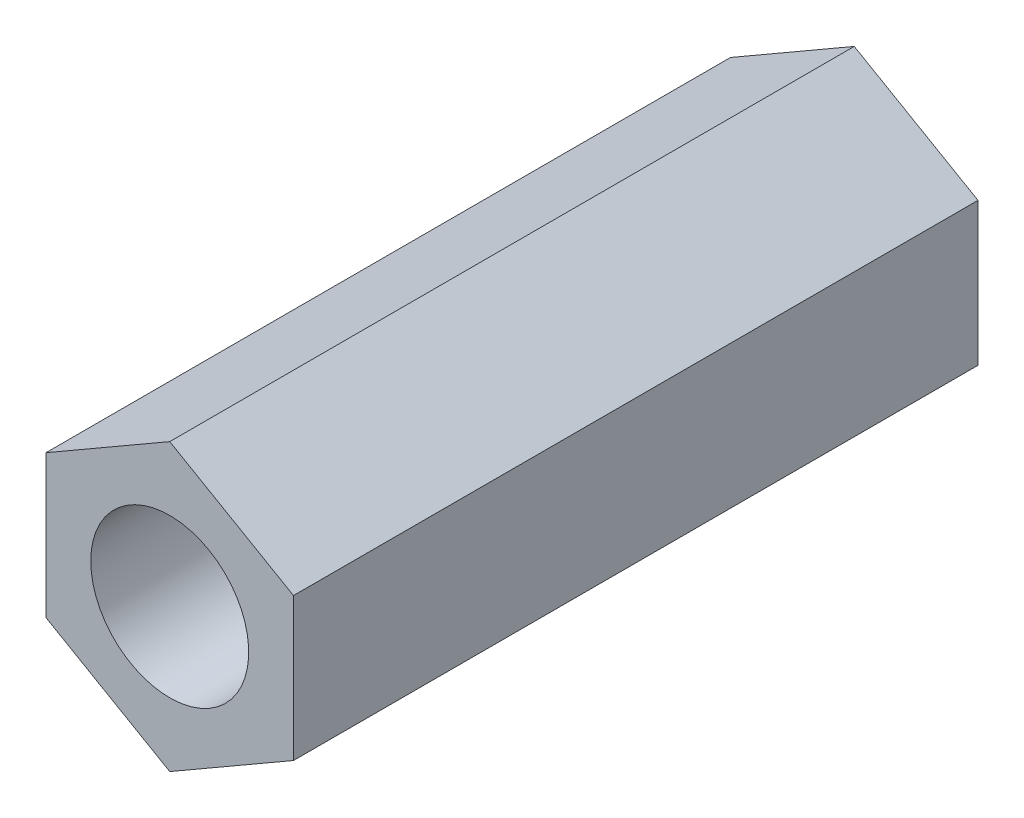
ISO-10303-21;
HEADER;
FILE_DESCRIPTION(('STEP AP214'),'2;1');
FILE_NAME('part.step','',(''),(''),'','','');
FILE_SCHEMA(('AUTOMOTIVE_DESIGN { 1 0 10303 214 1 1 1 1 }'));
ENDSEC;
DATA;
#1=APPLICATION_CONTEXT('core data for automotive mechanical design processes');
#2=APPLICATION_PROTOCOL_DEFINITION('international standard','automotive_design',2000,#1);
#3=PRODUCT_CONTEXT('',#1,'mechanical');
#4=PRODUCT('Part','Part','',(#3));
#5=PRODUCT_RELATED_PRODUCT_CATEGORY('part','',(#4));
#6=PRODUCT_DEFINITION_FORMATION('','',#4);
#7=PRODUCT_DEFINITION_CONTEXT('part definition',#1,'design');
#8=PRODUCT_DEFINITION('design','',#6,#7);
#9=PRODUCT_DEFINITION_SHAPE('','',#8);
#10=(LENGTH_UNIT() NAMED_UNIT(*) SI_UNIT(.MILLI.,.METRE.));
#11=(NAMED_UNIT(*) PLANE_ANGLE_UNIT() SI_UNIT($,.RADIAN.));
#12=(NAMED_UNIT(*) SI_UNIT($,.STERADIAN.) SOLID_ANGLE_UNIT());
#13=UNCERTAINTY_MEASURE_WITH_UNIT(LENGTH_MEASURE(1.E-05),#10,'distance_accuracy_value','');
#14=(GEOMETRIC_REPRESENTATION_CONTEXT(3) GLOBAL_UNCERTAINTY_ASSIGNED_CONTEXT((#13)) GLOBAL_UNIT_ASSIGNED_CONTEXT((#10,
#11,#12)) REPRESENTATION_CONTEXT('',''));
#15=CARTESIAN_POINT('',(0.,0.,0.));
#16=DIRECTION('',(0.,0.,1.));
#17=DIRECTION('',(1.,0.,0.));
#18=AXIS2_PLACEMENT_3D('',#15,#16,#17);
#19=CARTESIAN_POINT('',(0.,0.,13.));
#20=DIRECTION('',(0.,0.,1.));
#21=DIRECTION('',(1.,0.,0.));
#22=AXIS2_PLACEMENT_3D('',#19,#20,#21);
#23=PLANE('',#22);
#24=DIRECTION('',(0.866025403784439,0.5,0.));
#25=VECTOR('',#24,1.);
#26=CARTESIAN_POINT('',(0.,-2.71354626519124,13.));
#27=LINE('',#26,#25);
#28=CARTESIAN_POINT('',(0.,-2.71354626519124,13.));
#29=VERTEX_POINT('',#28);
#30=CARTESIAN_POINT('',(2.35,-1.35677313259562,13.));
#31=VERTEX_POINT('',#30);
#32=EDGE_CURVE('E155',#29,#31,#27,.T.);
#33=ORIENTED_EDGE('',*,*,#32,.T.);
#34=DIRECTION('',(0.,1.,0.));
#35=VECTOR('',#34,1.);
#36=CARTESIAN_POINT('',(2.35,-1.35677313259562,13.));
#37=LINE('',#36,#35);
#38=CARTESIAN_POINT('',(2.35,1.35677313259562,13.));
#39=VERTEX_POINT('',#38);
#40=EDGE_CURVE('E99',#31,#39,#37,.T.);
#41=ORIENTED_EDGE('',*,*,#40,.T.);
#42=DIRECTION('',(-0.866025403784439,0.5,0.));
#43=VECTOR('',#42,1.);
#44=CARTESIAN_POINT('',(2.35,1.35677313259562,13.));
#45=LINE('',#44,#43);
#46=CARTESIAN_POINT('',(0.,2.71354626519124,13.));
#47=VERTEX_POINT('',#46);
#48=EDGE_CURVE('E113',#39,#47,#45,.T.);
#49=ORIENTED_EDGE('',*,*,#48,.T.);
#50=DIRECTION('',(-0.866025403784439,-0.5,0.));
#51=VECTOR('',#50,1.);
#52=CARTESIAN_POINT('',(0.,2.71354626519124,13.));
#53=LINE('',#52,#51);
#54=CARTESIAN_POINT('',(-2.35,1.35677313259562,13.));
#55=VERTEX_POINT('',#54);
#56=EDGE_CURVE('E110',#47,#55,#53,.T.);
#57=ORIENTED_EDGE('',*,*,#56,.T.);
#58=DIRECTION('',(0.,-1.,0.));
#59=VECTOR('',#58,1.);
#60=CARTESIAN_POINT('',(-2.35,1.35677313259562,13.));
#61=LINE('',#60,#59);
#62=CARTESIAN_POINT('',(-2.35,-1.35677313259562,13.));
#63=VERTEX_POINT('',#62);
#64=EDGE_CURVE('E111',#55,#63,#61,.T.);
#65=ORIENTED_EDGE('',*,*,#64,.T.);
#66=DIRECTION('',(0.866025403784439,-0.5,0.));
#67=VECTOR('',#66,1.);
#68=CARTESIAN_POINT('',(-2.35,-1.35677313259562,13.));
#69=LINE('',#68,#67);
#70=EDGE_CURVE('E62',#63,#29,#69,.T.);
#71=ORIENTED_EDGE('',*,*,#70,.T.);
#72=EDGE_LOOP('',(#33,#41,#49,#57,#65,#71));
#73=FACE_BOUND('',#72,.T.);
#74=CARTESIAN_POINT('',(0.,0.,13.));
#75=DIRECTION('',(0.,0.,1.));
#76=DIRECTION('',(1.,0.,0.));
#77=AXIS2_PLACEMENT_3D('',#74,#75,#76);
#78=CIRCLE('',#77,1.5);
#79=CARTESIAN_POINT('',(-1.5,0.,13.));
#80=VERTEX_POINT('',#79);
#81=EDGE_CURVE('E140',#80,#80,#78,.T.);
#82=ORIENTED_EDGE('',*,*,#81,.F.);
#83=EDGE_LOOP('',(#82));
#84=FACE_BOUND('',#83,.T.);
#85=ADVANCED_FACE('F44',(#73,#84),#23,.T.);
#86=CARTESIAN_POINT('',(0.,0.,0.));
#87=DIRECTION('',(0.,0.,1.));
#88=DIRECTION('',(1.,0.,0.));
#89=AXIS2_PLACEMENT_3D('',#86,#87,#88);
#90=PLANE('',#89);
#91=DIRECTION('',(0.866025403784439,0.5,0.));
#92=VECTOR('',#91,1.);
#93=CARTESIAN_POINT('',(0.,-2.71354626519124,0.));
#94=LINE('',#93,#92);
#95=CARTESIAN_POINT('',(0.,-2.71354626519124,0.));
#96=VERTEX_POINT('',#95);
#97=CARTESIAN_POINT('',(2.35,-1.35677313259562,0.));
#98=VERTEX_POINT('',#97);
#99=EDGE_CURVE('E133',#96,#98,#94,.T.);
#100=ORIENTED_EDGE('',*,*,#99,.F.);
#101=DIRECTION('',(0.866025403784439,-0.5,0.));
#102=VECTOR('',#101,1.);
#103=CARTESIAN_POINT('',(-2.35,-1.35677313259562,0.));
#104=LINE('',#103,#102);
#105=CARTESIAN_POINT('',(-2.35,-1.35677313259562,0.));
#106=VERTEX_POINT('',#105);
#107=EDGE_CURVE('E92',#106,#96,#104,.T.);
#108=ORIENTED_EDGE('',*,*,#107,.F.);
#109=DIRECTION('',(0.,-1.,0.));
#110=VECTOR('',#109,1.);
#111=CARTESIAN_POINT('',(-2.35,1.35677313259562,0.));
#112=LINE('',#111,#110);
#113=CARTESIAN_POINT('',(-2.35,1.35677313259562,0.));
#114=VERTEX_POINT('',#113);
#115=EDGE_CURVE('E87',#114,#106,#112,.T.);
#116=ORIENTED_EDGE('',*,*,#115,.F.);
#117=DIRECTION('',(-0.866025403784439,-0.5,0.));
#118=VECTOR('',#117,1.);
#119=CARTESIAN_POINT('',(0.,2.71354626519124,0.));
#120=LINE('',#119,#118);
#121=CARTESIAN_POINT('',(0.,2.71354626519124,0.));
#122=VERTEX_POINT('',#121);
#123=EDGE_CURVE('E125',#122,#114,#120,.T.);
#124=ORIENTED_EDGE('',*,*,#123,.F.);
#125=DIRECTION('',(-0.866025403784439,0.5,0.));
#126=VECTOR('',#125,1.);
#127=CARTESIAN_POINT('',(2.35,1.35677313259562,0.));
#128=LINE('',#127,#126);
#129=CARTESIAN_POINT('',(2.35,1.35677313259562,0.));
#130=VERTEX_POINT('',#129);
#131=EDGE_CURVE('E141',#130,#122,#128,.T.);
#132=ORIENTED_EDGE('',*,*,#131,.F.);
#133=DIRECTION('',(0.,1.,0.));
#134=VECTOR('',#133,1.);
#135=CARTESIAN_POINT('',(2.35,-1.35677313259562,0.));
#136=LINE('',#135,#134);
#137=EDGE_CURVE('E138',#98,#130,#136,.T.);
#138=ORIENTED_EDGE('',*,*,#137,.F.);
#139=EDGE_LOOP('',(#100,#108,#116,#124,#132,#138));
#140=FACE_BOUND('',#139,.T.);
#141=CARTESIAN_POINT('',(0.,0.,0.));
#142=DIRECTION('',(0.,0.,1.));
#143=DIRECTION('',(1.,0.,0.));
#144=AXIS2_PLACEMENT_3D('',#141,#142,#143);
#145=CIRCLE('',#144,1.5);
#146=CARTESIAN_POINT('',(-1.5,0.,0.));
#147=VERTEX_POINT('',#146);
#148=EDGE_CURVE('E248',#147,#147,#145,.T.);
#149=ORIENTED_EDGE('',*,*,#148,.T.);
#150=EDGE_LOOP('',(#149));
#151=FACE_BOUND('',#150,.T.);
#152=ADVANCED_FACE('F164',(#140,#151),#90,.F.);
#153=CARTESIAN_POINT('',(0.,-2.71354626519124,13.));
#154=DIRECTION('',(-0.5,0.866025403784439,0.));
#155=DIRECTION('',(-0.866025403784439,-0.5,0.));
#156=AXIS2_PLACEMENT_3D('',#153,#154,#155);
#157=PLANE('',#156);
#158=ORIENTED_EDGE('',*,*,#99,.T.);
#159=DIRECTION('',(0.,0.,-1.));
#160=VECTOR('',#159,1.);
#161=CARTESIAN_POINT('',(2.35,-1.35677313259562,13.));
#162=LINE('',#161,#160);
#163=EDGE_CURVE('E11',#31,#98,#162,.T.);
#164=ORIENTED_EDGE('',*,*,#163,.F.);
#165=ORIENTED_EDGE('',*,*,#32,.F.);
#166=DIRECTION('',(0.,0.,-1.));
#167=VECTOR('',#166,1.);
#168=CARTESIAN_POINT('',(0.,-2.71354626519124,13.));
#169=LINE('',#168,#167);
#170=EDGE_CURVE('E132',#29,#96,#169,.T.);
#171=ORIENTED_EDGE('',*,*,#170,.T.);
#172=EDGE_LOOP('',(#158,#164,#165,#171));
#173=FACE_BOUND('',#172,.T.);
#174=ADVANCED_FACE('F50',(#173),#157,.F.);
#175=CARTESIAN_POINT('',(2.35,-1.35677313259562,13.));
#176=DIRECTION('',(-1.,0.,0.));
#177=DIRECTION('',(0.,-1.,0.));
#178=AXIS2_PLACEMENT_3D('',#175,#176,#177);
#179=PLANE('',#178);
#180=ORIENTED_EDGE('',*,*,#137,.T.);
#181=DIRECTION('',(0.,0.,-1.));
#182=VECTOR('',#181,1.);
#183=CARTESIAN_POINT('',(2.35,1.35677313259562,13.));
#184=LINE('',#183,#182);
#185=EDGE_CURVE('E54',#39,#130,#184,.T.);
#186=ORIENTED_EDGE('',*,*,#185,.F.);
#187=ORIENTED_EDGE('',*,*,#40,.F.);
#188=ORIENTED_EDGE('',*,*,#163,.T.);
#189=EDGE_LOOP('',(#180,#186,#187,#188));
#190=FACE_BOUND('',#189,.T.);
#191=ADVANCED_FACE('F188',(#190),#179,.F.);
#192=CARTESIAN_POINT('',(2.35,1.35677313259562,13.));
#193=DIRECTION('',(-0.5,-0.866025403784438,0.));
#194=DIRECTION('',(0.866025403784439,-0.5,0.));
#195=AXIS2_PLACEMENT_3D('',#192,#193,#194);
#196=PLANE('',#195);
#197=ORIENTED_EDGE('',*,*,#131,.T.);
#198=DIRECTION('',(0.,0.,-1.));
#199=VECTOR('',#198,1.);
#200=CARTESIAN_POINT('',(0.,2.71354626519124,13.));
#201=LINE('',#200,#199);
#202=EDGE_CURVE('E121',#47,#122,#201,.T.);
#203=ORIENTED_EDGE('',*,*,#202,.F.);
#204=ORIENTED_EDGE('',*,*,#48,.F.);
#205=ORIENTED_EDGE('',*,*,#185,.T.);
#206=EDGE_LOOP('',(#197,#203,#204,#205));
#207=FACE_BOUND('',#206,.T.);
#208=ADVANCED_FACE('F162',(#207),#196,.F.);
#209=CARTESIAN_POINT('',(0.,2.71354626519124,13.));
#210=DIRECTION('',(0.5,-0.866025403784439,0.));
#211=DIRECTION('',(0.866025403784439,0.5,0.));
#212=AXIS2_PLACEMENT_3D('',#209,#210,#211);
#213=PLANE('',#212);
#214=ORIENTED_EDGE('',*,*,#123,.T.);
#215=DIRECTION('',(0.,0.,-1.));
#216=VECTOR('',#215,1.);
#217=CARTESIAN_POINT('',(-2.35,1.35677313259562,13.));
#218=LINE('',#217,#216);
#219=EDGE_CURVE('E118',#55,#114,#218,.T.);
#220=ORIENTED_EDGE('',*,*,#219,.F.);
#221=ORIENTED_EDGE('',*,*,#56,.F.);
#222=ORIENTED_EDGE('',*,*,#202,.T.);
#223=EDGE_LOOP('',(#214,#220,#221,#222));
#224=FACE_BOUND('',#223,.T.);
#225=ADVANCED_FACE('F119',(#224),#213,.F.);
#226=CARTESIAN_POINT('',(-2.35,1.35677313259562,13.));
#227=DIRECTION('',(1.,0.,0.));
#228=DIRECTION('',(0.,1.,0.));
#229=AXIS2_PLACEMENT_3D('',#226,#227,#228);
#230=PLANE('',#229);
#231=ORIENTED_EDGE('',*,*,#115,.T.);
#232=DIRECTION('',(0.,0.,-1.));
#233=VECTOR('',#232,1.);
#234=CARTESIAN_POINT('',(-2.35,-1.35677313259562,13.));
#235=LINE('',#234,#233);
#236=EDGE_CURVE('E123',#63,#106,#235,.T.);
#237=ORIENTED_EDGE('',*,*,#236,.F.);
#238=ORIENTED_EDGE('',*,*,#64,.F.);
#239=ORIENTED_EDGE('',*,*,#219,.T.);
#240=EDGE_LOOP('',(#231,#237,#238,#239));
#241=FACE_BOUND('',#240,.T.);
#242=ADVANCED_FACE('F130',(#241),#230,.F.);
#243=CARTESIAN_POINT('',(-2.35,-1.35677313259562,13.));
#244=DIRECTION('',(0.5,0.866025403784439,0.));
#245=DIRECTION('',(-0.866025403784439,0.5,0.));
#246=AXIS2_PLACEMENT_3D('',#243,#244,#245);
#247=PLANE('',#246);
#248=ORIENTED_EDGE('',*,*,#107,.T.);
#249=ORIENTED_EDGE('',*,*,#170,.F.);
#250=ORIENTED_EDGE('',*,*,#70,.F.);
#251=ORIENTED_EDGE('',*,*,#236,.T.);
#252=EDGE_LOOP('',(#248,#249,#250,#251));
#253=FACE_BOUND('',#252,.T.);
#254=ADVANCED_FACE('F167',(#253),#247,.F.);
#255=CARTESIAN_POINT('',(0.,0.,13.));
#256=DIRECTION('',(0.,0.,-1.));
#257=DIRECTION('',(-1.,0.,0.));
#258=AXIS2_PLACEMENT_3D('',#255,#256,#257);
#259=CYLINDRICAL_SURFACE('',#258,1.5);
#260=CARTESIAN_POINT('',(-1.5,0.,13.));
#261=CARTESIAN_POINT('',(-1.5,0.,12.8645833333333));
#262=CARTESIAN_POINT('',(-1.5,0.,12.7291666666667));
#263=CARTESIAN_POINT('',(-1.5,0.,12.4583333333333));
#264=CARTESIAN_POINT('',(-1.5,0.,12.3229166666667));
#265=CARTESIAN_POINT('',(-1.5,0.,12.0520833333333));
#266=CARTESIAN_POINT('',(-1.5,0.,11.9166666666667));
#267=CARTESIAN_POINT('',(-1.5,0.,11.6458333333333));
#268=CARTESIAN_POINT('',(-1.5,0.,11.5104166666667));
#269=CARTESIAN_POINT('',(-1.5,0.,11.2395833333333));
#270=CARTESIAN_POINT('',(-1.5,0.,11.1041666666667));
#271=CARTESIAN_POINT('',(-1.5,0.,10.8333333333333));
#272=CARTESIAN_POINT('',(-1.5,0.,10.6979166666667));
#273=CARTESIAN_POINT('',(-1.5,0.,10.4270833333333));
#274=CARTESIAN_POINT('',(-1.5,0.,10.2916666666667));
#275=CARTESIAN_POINT('',(-1.5,0.,10.0208333333333));
#276=CARTESIAN_POINT('',(-1.5,0.,9.88541666666667));
#277=CARTESIAN_POINT('',(-1.5,0.,9.61458333333333));
#278=CARTESIAN_POINT('',(-1.5,0.,9.47916666666667));
#279=CARTESIAN_POINT('',(-1.5,0.,9.20833333333333));
#280=CARTESIAN_POINT('',(-1.5,0.,9.07291666666666));
#281=CARTESIAN_POINT('',(-1.5,0.,8.80208333333333));
#282=CARTESIAN_POINT('',(-1.5,0.,8.66666666666667));
#283=CARTESIAN_POINT('',(-1.5,0.,8.39583333333333));
#284=CARTESIAN_POINT('',(-1.5,0.,8.26041666666667));
#285=CARTESIAN_POINT('',(-1.5,0.,7.98958333333333));
#286=CARTESIAN_POINT('',(-1.5,0.,7.85416666666667));
#287=CARTESIAN_POINT('',(-1.5,0.,7.58333333333333));
#288=CARTESIAN_POINT('',(-1.5,0.,7.44791666666667));
#289=CARTESIAN_POINT('',(-1.5,0.,7.17708333333333));
#290=CARTESIAN_POINT('',(-1.5,0.,7.04166666666667));
#291=CARTESIAN_POINT('',(-1.5,0.,6.77083333333333));
#292=CARTESIAN_POINT('',(-1.5,0.,6.63541666666667));
#293=CARTESIAN_POINT('',(-1.5,0.,6.36458333333333));
#294=CARTESIAN_POINT('',(-1.5,0.,6.22916666666667));
#295=CARTESIAN_POINT('',(-1.5,0.,5.95833333333333));
#296=CARTESIAN_POINT('',(-1.5,0.,5.82291666666667));
#297=CARTESIAN_POINT('',(-1.5,0.,5.55208333333333));
#298=CARTESIAN_POINT('',(-1.5,0.,5.41666666666667));
#299=CARTESIAN_POINT('',(-1.5,0.,5.14583333333333));
#300=CARTESIAN_POINT('',(-1.5,0.,5.01041666666667));
#301=CARTESIAN_POINT('',(-1.5,0.,4.73958333333333));
#302=CARTESIAN_POINT('',(-1.5,0.,4.60416666666667));
#303=CARTESIAN_POINT('',(-1.5,0.,4.33333333333333));
#304=CARTESIAN_POINT('',(-1.5,0.,4.19791666666667));
#305=CARTESIAN_POINT('',(-1.5,0.,3.92708333333333));
#306=CARTESIAN_POINT('',(-1.5,0.,3.79166666666667));
#307=CARTESIAN_POINT('',(-1.5,0.,3.52083333333333));
#308=CARTESIAN_POINT('',(-1.5,0.,3.38541666666667));
#309=CARTESIAN_POINT('',(-1.5,0.,3.11458333333333));
#310=CARTESIAN_POINT('',(-1.5,0.,2.97916666666667));
#311=CARTESIAN_POINT('',(-1.5,0.,2.70833333333333));
#312=CARTESIAN_POINT('',(-1.5,0.,2.57291666666667));
#313=CARTESIAN_POINT('',(-1.5,0.,2.30208333333333));
#314=CARTESIAN_POINT('',(-1.5,0.,2.16666666666667));
#315=CARTESIAN_POINT('',(-1.5,0.,1.89583333333333));
#316=CARTESIAN_POINT('',(-1.5,0.,1.76041666666667));
#317=CARTESIAN_POINT('',(-1.5,0.,1.48958333333333));
#318=CARTESIAN_POINT('',(-1.5,0.,1.35416666666667));
#319=CARTESIAN_POINT('',(-1.5,0.,1.08333333333333));
#320=CARTESIAN_POINT('',(-1.5,0.,0.947916666666667));
#321=CARTESIAN_POINT('',(-1.5,0.,0.677083333333334));
#322=CARTESIAN_POINT('',(-1.5,0.,0.541666666666667));
#323=CARTESIAN_POINT('',(-1.5,0.,0.270833333333334));
#324=CARTESIAN_POINT('',(-1.5,0.,0.135416666666667));
#325=CARTESIAN_POINT('',(-1.5,0.,0.));
#326=B_SPLINE_CURVE_WITH_KNOTS('',3,(#260,#261,#262,#263,#264,#265,#266,#267,#268,#269,#270,
#271,#272,#273,#274,#275,#276,#277,#278,#279,#280,#281,#282,#283,#284,#285,#286,#287,#288,#289,
#290,#291,#292,#293,#294,#295,#296,#297,#298,#299,#300,#301,#302,#303,#304,#305,#306,#307,#308,
#309,#310,#311,#312,#313,#314,#315,#316,#317,#318,#319,#320,#321,#322,#323,#324,#325),
.UNSPECIFIED.,.F.,.F.,(4,2,2,2,2,2,2,2,2,2,2,2,2,2,2,2,2,2,2,2,2,2,2,2,2,2,2,2,2,2,2,2,4),(0.,
0.40625,0.812500000000001,1.21875,1.625,2.03125,2.4375,2.84375,3.25,3.65625,4.0625,4.46875,
4.875,5.28125,5.6875,6.09375,6.5,6.90625,7.3125,7.71875,8.125,8.53125,8.9375,9.34375,9.75,
10.15625,10.5625,10.96875,11.375,11.78125,12.1875,12.59375,13.),.UNSPECIFIED.);
#327=EDGE_CURVE('BSEAM175',#80,#147,#326,.T.);
#328=ORIENTED_EDGE('',*,*,#81,.T.);
#329=ORIENTED_EDGE('',*,*,#148,.F.);
#330=ORIENTED_EDGE('',*,*,#327,.T.);
#331=ORIENTED_EDGE('',*,*,#327,.F.);
#332=EDGE_LOOP('',(#328,#330,#329,#331));
#333=FACE_BOUND('',#332,.T.);
#334=ADVANCED_FACE('F175',(#333),#259,.F.);
#335=CLOSED_SHELL('',(#85,#152,#174,#191,#208,#225,#242,#254,#334));
#336=MANIFOLD_SOLID_BREP('B2',#335);
#337=ADVANCED_BREP_SHAPE_REPRESENTATION('',(#18,#336),#14);
#338=SHAPE_DEFINITION_REPRESENTATION(#9,#337);
ENDSEC;
END-ISO-10303-21;
